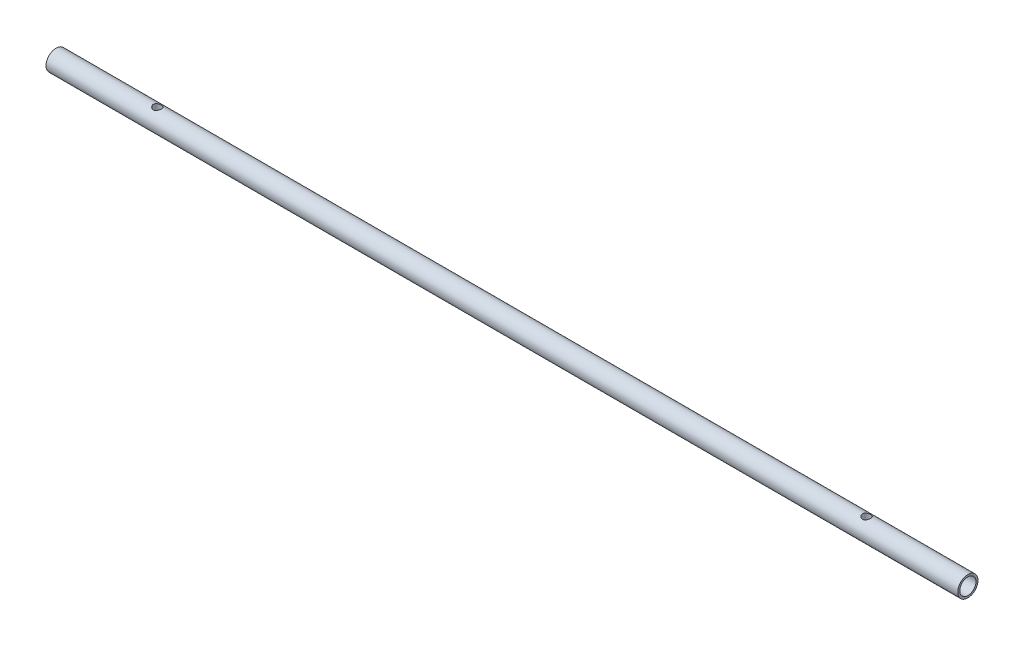
ISO-10303-21;
HEADER;
FILE_DESCRIPTION(('STEP AP214'),'2;1');
FILE_NAME('part.step','',(''),(''),'','','');
FILE_SCHEMA(('AUTOMOTIVE_DESIGN { 1 0 10303 214 1 1 1 1 }'));
ENDSEC;
DATA;
#1=APPLICATION_CONTEXT('core data for automotive mechanical design processes');
#2=APPLICATION_PROTOCOL_DEFINITION('international standard','automotive_design',2000,#1);
#3=PRODUCT_CONTEXT('',#1,'mechanical');
#4=PRODUCT('Part','Part','',(#3));
#5=PRODUCT_RELATED_PRODUCT_CATEGORY('part','',(#4));
#6=PRODUCT_DEFINITION_FORMATION('','',#4);
#7=PRODUCT_DEFINITION_CONTEXT('part definition',#1,'design');
#8=PRODUCT_DEFINITION('design','',#6,#7);
#9=PRODUCT_DEFINITION_SHAPE('','',#8);
#10=(LENGTH_UNIT() NAMED_UNIT(*) SI_UNIT(.MILLI.,.METRE.));
#11=(NAMED_UNIT(*) PLANE_ANGLE_UNIT() SI_UNIT($,.RADIAN.));
#12=(NAMED_UNIT(*) SI_UNIT($,.STERADIAN.) SOLID_ANGLE_UNIT());
#13=UNCERTAINTY_MEASURE_WITH_UNIT(LENGTH_MEASURE(1.E-05),#10,'distance_accuracy_value','');
#14=(GEOMETRIC_REPRESENTATION_CONTEXT(3) GLOBAL_UNCERTAINTY_ASSIGNED_CONTEXT((#13)) GLOBAL_UNIT_ASSIGNED_CONTEXT((#10,
#11,#12)) REPRESENTATION_CONTEXT('',''));
#15=CARTESIAN_POINT('',(0.,0.,0.));
#16=DIRECTION('',(0.,0.,1.));
#17=DIRECTION('',(1.,0.,0.));
#18=AXIS2_PLACEMENT_3D('',#15,#16,#17);
#19=CARTESIAN_POINT('',(900.,0.,0.));
#20=DIRECTION('',(-1.,0.,0.));
#21=DIRECTION('',(0.,0.,1.));
#22=AXIS2_PLACEMENT_3D('',#19,#20,#21);
#23=CYLINDRICAL_SURFACE('',#22,10.);
#24=CARTESIAN_POINT('',(900.,0.,0.));
#25=DIRECTION('',(1.,0.,0.));
#26=DIRECTION('',(0.,0.,-1.));
#27=AXIS2_PLACEMENT_3D('',#24,#25,#26);
#28=CIRCLE('',#27,10.);
#29=CARTESIAN_POINT('',(900.,0.,-10.));
#30=VERTEX_POINT('',#29);
#31=EDGE_CURVE('E10',#30,#30,#28,.T.);
#32=ORIENTED_EDGE('',*,*,#31,.F.);
#33=EDGE_LOOP('',(#32));
#34=FACE_BOUND('',#33,.T.);
#35=CARTESIAN_POINT('',(0.,0.,0.));
#36=DIRECTION('',(1.,0.,0.));
#37=DIRECTION('',(0.,0.,-1.));
#38=AXIS2_PLACEMENT_3D('',#35,#36,#37);
#39=CIRCLE('',#38,10.);
#40=CARTESIAN_POINT('',(0.,0.,-10.));
#41=VERTEX_POINT('',#40);
#42=EDGE_CURVE('E47',#41,#41,#39,.T.);
#43=ORIENTED_EDGE('',*,*,#42,.T.);
#44=EDGE_LOOP('',(#43));
#45=FACE_BOUND('',#44,.T.);
#46=CARTESIAN_POINT('',(800.,-9.16515138991173,-3.99999999999989));
#47=CARTESIAN_POINT('',(800.107177496784,-9.16515220722511,-3.99999917996674));
#48=CARTESIAN_POINT('',(800.214387859795,-9.16703782704593,-3.99568627578821));
#49=CARTESIAN_POINT('',(800.428032094171,-9.17451890581273,-3.97847804504304));
#50=CARTESIAN_POINT('',(800.534465449945,-9.18011663538451,-3.96557746554288));
#51=CARTESIAN_POINT('',(800.745935953356,-9.19485078616079,-3.93129357708767));
#52=CARTESIAN_POINT('',(800.850969884849,-9.20399425848331,-3.90989336356559));
#53=CARTESIAN_POINT('',(801.05868759719,-9.22551446198265,-3.85883937208567));
#54=CARTESIAN_POINT('',(801.161370383102,-9.23789253541718,-3.82918216740115));
#55=CARTESIAN_POINT('',(801.463989726629,-9.27920231487641,-3.72849978450431));
#56=CARTESIAN_POINT('',(801.659537920964,-9.3123881019353,-3.6455922809955));
#57=CARTESIAN_POINT('',(802.033801268673,-9.38629512671442,-3.45083256453876));
#58=CARTESIAN_POINT('',(802.212520085891,-9.42701471853539,-3.3389866715959));
#59=CARTESIAN_POINT('',(802.558511813602,-9.51401677460932,-3.08264624953188));
#60=CARTESIAN_POINT('',(802.724710433289,-9.56047821792027,-2.9367593327213));
#61=CARTESIAN_POINT('',(803.031060408042,-9.65224928088022,-2.61941759406587));
#62=CARTESIAN_POINT('',(803.171202660755,-9.69755849326331,-2.44795387495408));
#63=CARTESIAN_POINT('',(803.426812109837,-9.78406811808178,-2.07601279574984));
#64=CARTESIAN_POINT('',(803.541088419969,-9.82503606295849,-1.87465797803856));
#65=CARTESIAN_POINT('',(803.733687319677,-9.8960785633395,-1.45365059895498));
#66=CARTESIAN_POINT('',(803.812024539433,-9.92615755049624,-1.23400552632818));
#67=CARTESIAN_POINT('',(803.926682927323,-9.97076649749865,-0.793932865332274));
#68=CARTESIAN_POINT('',(803.964854615998,-9.98597873479395,-0.574057972725381));
#69=CARTESIAN_POINT('',(804.004056983501,-10.001606214367,-0.130532654160029));
#70=CARTESIAN_POINT('',(804.005101515044,-10.0020269755724,0.0931163324632467));
#71=CARTESIAN_POINT('',(803.971034457453,-9.98843925626005,0.524464988664043));
#72=CARTESIAN_POINT('',(803.937950453703,-9.9752399353889,0.732354905542557));
#73=CARTESIAN_POINT('',(803.840014248182,-9.93698582942362,1.13934621864239));
#74=CARTESIAN_POINT('',(803.775159715416,-9.91193017443783,1.33844696883612));
#75=CARTESIAN_POINT('',(803.614727034028,-9.85193648913815,1.72579587696684));
#76=CARTESIAN_POINT('',(803.518700570311,-9.81685520932145,1.91383524674328));
#77=CARTESIAN_POINT('',(803.299069986219,-9.74029170360848,2.2716163014973));
#78=CARTESIAN_POINT('',(803.175456413815,-9.6988072853438,2.44135168544));
#79=CARTESIAN_POINT('',(802.894701728095,-9.61043274352157,2.76953765597605));
#80=CARTESIAN_POINT('',(802.73589221485,-9.56336653023495,2.92651569053145));
#81=CARTESIAN_POINT('',(802.39401885634,-9.47123321946551,3.2122148307864));
#82=CARTESIAN_POINT('',(802.21094710361,-9.4261667801616,3.34092668757424));
#83=CARTESIAN_POINT('',(801.819161955251,-9.3419379481804,3.5698083774382));
#84=CARTESIAN_POINT('',(801.609870339322,-9.30297828115415,3.66906930327241));
#85=CARTESIAN_POINT('',(801.175569019376,-9.23775180688173,3.83035251973295));
#86=CARTESIAN_POINT('',(800.950569630547,-9.21147675782625,3.89239899675592));
#87=CARTESIAN_POINT('',(800.505928445065,-9.17659519405436,3.97390989770969));
#88=CARTESIAN_POINT('',(800.286799105743,-9.16700732912279,3.99574419362899));
#89=CARTESIAN_POINT('',(799.847845584481,-9.16378995738082,4.00312265288566));
#90=CARTESIAN_POINT('',(799.628021633448,-9.1701556112073,3.98867782118244));
#91=CARTESIAN_POINT('',(799.207082130086,-9.19712088718234,3.9260657895799));
#92=CARTESIAN_POINT('',(799.0056141252,-9.21688915596611,3.87986612404753));
#93=CARTESIAN_POINT('',(798.613423190429,-9.26740102054687,3.75760837382155));
#94=CARTESIAN_POINT('',(798.422702653785,-9.29814704977203,3.68154366860441));
#95=CARTESIAN_POINT('',(798.048795284409,-9.3686756372021,3.49827127896293));
#96=CARTESIAN_POINT('',(797.866227622613,-9.40877409278364,3.38992573652896));
#97=CARTESIAN_POINT('',(797.521034025115,-9.49300770315594,3.14633044888361));
#98=CARTESIAN_POINT('',(797.358416254402,-9.53714449792086,3.01106974696417));
#99=CARTESIAN_POINT('',(797.045253182809,-9.62841831942848,2.70568842336037));
#100=CARTESIAN_POINT('',(796.896486869445,-9.67553614570512,2.53373085888835));
#101=CARTESIAN_POINT('',(796.629645846752,-9.76439589135029,2.16616726673912));
#102=CARTESIAN_POINT('',(796.511572386703,-9.80613759186126,1.97056027694169));
#103=CARTESIAN_POINT('',(796.309904747181,-9.87967431800933,1.56055986799709));
#104=CARTESIAN_POINT('',(796.226302312053,-9.91147172481883,1.34617096196478));
#105=CARTESIAN_POINT('',(796.096902294801,-9.9614542693725,0.904787181861386));
#106=CARTESIAN_POINT('',(796.051084195687,-9.9796467941012,0.677799220674636));
#107=CARTESIAN_POINT('',(796.000990598089,-9.99958016425669,0.233633020611832));
#108=CARTESIAN_POINT('',(795.994199747923,-10.0023169350655,0.0167809848941637));
#109=CARTESIAN_POINT('',(796.015710953721,-9.9937208474038,-0.414867671174858));
#110=CARTESIAN_POINT('',(796.044007697521,-9.98239011871254,-0.629664597703018));
#111=CARTESIAN_POINT('',(796.133093594213,-9.94743026789156,-1.04434180494591));
#112=CARTESIAN_POINT('',(796.192857956505,-9.92418961491738,-1.24447761316999));
#113=CARTESIAN_POINT('',(796.342105544758,-9.86789895440955,-1.63184470564411));
#114=CARTESIAN_POINT('',(796.431594252056,-9.83484713776135,-1.81907360209118));
#115=CARTESIAN_POINT('',(796.642206647569,-9.76036189588763,-2.18440609879397));
#116=CARTESIAN_POINT('',(796.764553544096,-9.71862262764551,-2.36174083104882));
#117=CARTESIAN_POINT('',(797.035576083636,-9.63178803063431,-2.69410799958839));
#118=CARTESIAN_POINT('',(797.184262624039,-9.58669131729772,-2.84913115669903));
#119=CARTESIAN_POINT('',(797.514634238866,-9.49475540255922,-3.14240275826144));
#120=CARTESIAN_POINT('',(797.697792298702,-9.44798115653709,-3.27901865020174));
#121=CARTESIAN_POINT('',(798.085869721248,-9.36099292501489,-3.51969402497221));
#122=CARTESIAN_POINT('',(798.290791638666,-9.32077971107738,-3.62374968011081));
#123=CARTESIAN_POINT('',(798.69812394378,-9.2551790064237,-3.78798515690825));
#124=CARTESIAN_POINT('',(798.899107675946,-9.22878451494605,-3.85126569346861));
#125=CARTESIAN_POINT('',(799.206638959791,-9.19885565843393,-3.92194632104978));
#126=CARTESIAN_POINT('',(799.310073035895,-9.1904927063377,-3.94146052144912));
#127=CARTESIAN_POINT('',(799.518356929611,-9.17721200341615,-3.97228850679676));
#128=CARTESIAN_POINT('',(799.623205889396,-9.17229225293175,-3.98360705155146));
#129=CARTESIAN_POINT('',(799.773550591353,-9.16783675423421,-3.99384232103274));
#130=CARTESIAN_POINT('',(799.818799830322,-9.16683059815418,-3.99615058414983));
#131=CARTESIAN_POINT('',(799.909364084215,-9.16548771864782,-3.99922965337513));
#132=CARTESIAN_POINT('',(799.954679103716,-9.16515104430397,-4.00000034675773));
#133=CARTESIAN_POINT('',(800.,-9.16515138991173,-3.99999999999989));
#134=B_SPLINE_CURVE_WITH_KNOTS('',3,(#46,#47,#48,#49,#50,#51,#52,#53,#54,#55,#56,#57,#58,#59,
#60,#61,#62,#63,#64,#65,#66,#67,#68,#69,#70,#71,#72,#73,#74,#75,#76,#77,#78,#79,#80,#81,#82,#83,
#84,#85,#86,#87,#88,#89,#90,#91,#92,#93,#94,#95,#96,#97,#98,#99,#100,#101,#102,#103,#104,#105,
#106,#107,#108,#109,#110,#111,#112,#113,#114,#115,#116,#117,#118,#119,#120,#121,#122,#123,#124,
#125,#126,#127,#128,#129,#130,#131,#132,#133),.UNSPECIFIED.,.T.,.F.,(4,2,2,2,2,2,2,2,2,2,2,2,2,
2,2,2,2,2,2,2,2,2,2,2,2,2,2,2,2,2,2,2,2,2,2,2,2,2,2,2,2,2,2,4),(0.,0.321486083338427,
0.643168995111234,0.965494918272717,1.28795480954369,1.92974178448592,2.57138871437642,
3.24631250358765,3.92147162486602,4.62325351972772,5.32474947728874,5.99228379564277,
6.65956904401253,7.28937303450512,7.91922324048022,8.55856614259706,9.19812843669964,
9.87968101952601,10.5614562804415,11.2624893122442,11.963066233901,12.6208430883875,
13.2784204360578,13.8985450996019,14.5188073109317,15.1642232309528,15.8099024284158,
16.5032748228384,17.1966754349538,17.889909884155,18.5827676569814,19.2304209330178,
19.8779761681507,20.5056400267657,21.1334196944703,21.7889411606971,22.4447344691827,
23.1411252036109,23.8375977730824,24.4715333542802,24.7879924179092,25.1042675432744,
25.2402006430815,25.3761437083404),.UNSPECIFIED.);
#135=CARTESIAN_POINT('',(800.,-9.16515138991173,-3.99999999999989));
#136=VERTEX_POINT('',#135);
#137=EDGE_CURVE('E58',#136,#136,#134,.T.);
#138=ORIENTED_EDGE('',*,*,#137,.F.);
#139=EDGE_LOOP('',(#138));
#140=FACE_BOUND('',#139,.T.);
#141=CARTESIAN_POINT('',(800.,9.16515138991173,-3.99999999999989));
#142=CARTESIAN_POINT('',(799.892822503216,9.16515220722511,-3.99999917996674));
#143=CARTESIAN_POINT('',(799.785612140205,9.16703782704593,-3.99568627578821));
#144=CARTESIAN_POINT('',(799.571967905829,9.17451890581273,-3.97847804504304));
#145=CARTESIAN_POINT('',(799.465534550055,9.18011663538451,-3.96557746554288));
#146=CARTESIAN_POINT('',(799.254064046644,9.19485078616079,-3.93129357708767));
#147=CARTESIAN_POINT('',(799.149030115151,9.20399425848331,-3.90989336356559));
#148=CARTESIAN_POINT('',(798.94131240281,9.22551446198265,-3.85883937208567));
#149=CARTESIAN_POINT('',(798.838629616898,9.23789253541718,-3.82918216740115));
#150=CARTESIAN_POINT('',(798.536010273371,9.27920231487641,-3.72849978450431));
#151=CARTESIAN_POINT('',(798.340462079036,9.3123881019353,-3.6455922809955));
#152=CARTESIAN_POINT('',(797.966198731327,9.38629512671442,-3.45083256453876));
#153=CARTESIAN_POINT('',(797.787479914109,9.42701471853539,-3.3389866715959));
#154=CARTESIAN_POINT('',(797.441488186399,9.51401677460932,-3.08264624953188));
#155=CARTESIAN_POINT('',(797.275289566711,9.56047821792027,-2.9367593327213));
#156=CARTESIAN_POINT('',(796.968939591958,9.65224928088022,-2.61941759406587));
#157=CARTESIAN_POINT('',(796.828797339245,9.69755849326331,-2.44795387495408));
#158=CARTESIAN_POINT('',(796.573187890163,9.78406811808178,-2.07601279574984));
#159=CARTESIAN_POINT('',(796.458911580031,9.82503606295849,-1.87465797803856));
#160=CARTESIAN_POINT('',(796.266312680323,9.8960785633395,-1.45365059895498));
#161=CARTESIAN_POINT('',(796.187975460567,9.92615755049624,-1.23400552632818));
#162=CARTESIAN_POINT('',(796.073317072677,9.97076649749865,-0.793932865332274));
#163=CARTESIAN_POINT('',(796.035145384002,9.98597873479395,-0.574057972725381));
#164=CARTESIAN_POINT('',(795.995943016499,10.001606214367,-0.130532654160029));
#165=CARTESIAN_POINT('',(795.994898484956,10.0020269755724,0.0931163324632467));
#166=CARTESIAN_POINT('',(796.028965542547,9.98843925626005,0.524464988664043));
#167=CARTESIAN_POINT('',(796.062049546297,9.9752399353889,0.732354905542557));
#168=CARTESIAN_POINT('',(796.159985751818,9.93698582942362,1.13934621864239));
#169=CARTESIAN_POINT('',(796.224840284585,9.91193017443783,1.33844696883612));
#170=CARTESIAN_POINT('',(796.385272965972,9.85193648913815,1.72579587696684));
#171=CARTESIAN_POINT('',(796.481299429689,9.81685520932145,1.91383524674328));
#172=CARTESIAN_POINT('',(796.700930013781,9.74029170360848,2.2716163014973));
#173=CARTESIAN_POINT('',(796.824543586185,9.6988072853438,2.44135168544));
#174=CARTESIAN_POINT('',(797.105298271905,9.61043274352157,2.76953765597605));
#175=CARTESIAN_POINT('',(797.26410778515,9.56336653023495,2.92651569053145));
#176=CARTESIAN_POINT('',(797.60598114366,9.47123321946551,3.2122148307864));
#177=CARTESIAN_POINT('',(797.78905289639,9.4261667801616,3.34092668757424));
#178=CARTESIAN_POINT('',(798.180838044749,9.3419379481804,3.5698083774382));
#179=CARTESIAN_POINT('',(798.390129660678,9.30297828115415,3.66906930327241));
#180=CARTESIAN_POINT('',(798.824430980624,9.23775180688173,3.83035251973295));
#181=CARTESIAN_POINT('',(799.049430369453,9.21147675782625,3.89239899675592));
#182=CARTESIAN_POINT('',(799.494071554935,9.17659519405436,3.97390989770969));
#183=CARTESIAN_POINT('',(799.713200894258,9.1670073291228,3.99574419362899));
#184=CARTESIAN_POINT('',(800.152154415519,9.16378995738082,4.00312265288566));
#185=CARTESIAN_POINT('',(800.371978366552,9.1701556112073,3.98867782118244));
#186=CARTESIAN_POINT('',(800.792917869914,9.19712088718233,3.92606578957991));
#187=CARTESIAN_POINT('',(800.9943858748,9.2168891559661,3.87986612404755));
#188=CARTESIAN_POINT('',(801.386576809571,9.26740102054687,3.75760837382158));
#189=CARTESIAN_POINT('',(801.577297346215,9.29814704977202,3.68154366860441));
#190=CARTESIAN_POINT('',(801.951204715591,9.36867563720211,3.49827127896291));
#191=CARTESIAN_POINT('',(802.133772377387,9.40877409278366,3.38992573652891));
#192=CARTESIAN_POINT('',(802.478965974885,9.49300770315596,3.14633044888354));
#193=CARTESIAN_POINT('',(802.641583745598,9.53714449792087,3.01106974696412));
#194=CARTESIAN_POINT('',(802.954746817191,9.6284183194285,2.70568842336033));
#195=CARTESIAN_POINT('',(803.103513130555,9.67553614570513,2.53373085888829));
#196=CARTESIAN_POINT('',(803.370354153248,9.7643958913503,2.16616726673905));
#197=CARTESIAN_POINT('',(803.488427613298,9.80613759186126,1.97056027694164));
#198=CARTESIAN_POINT('',(803.69009525282,9.87967431800934,1.56055986799706));
#199=CARTESIAN_POINT('',(803.773697687947,9.91147172481884,1.34617096196475));
#200=CARTESIAN_POINT('',(803.903097705199,9.9614542693725,0.904787181861355));
#201=CARTESIAN_POINT('',(803.948915804313,9.9796467941012,0.677799220674615));
#202=CARTESIAN_POINT('',(803.999009401911,9.99958016425669,0.233633020611829));
#203=CARTESIAN_POINT('',(804.005800252077,10.0023169350655,0.0167809848941661));
#204=CARTESIAN_POINT('',(803.98428904628,9.9937208474038,-0.414867671174853));
#205=CARTESIAN_POINT('',(803.955992302479,9.98239011871254,-0.629664597703016));
#206=CARTESIAN_POINT('',(803.866906405787,9.94743026789156,-1.04434180494591));
#207=CARTESIAN_POINT('',(803.807142043495,9.92418961491738,-1.24447761316999));
#208=CARTESIAN_POINT('',(803.657894455242,9.86789895440955,-1.63184470564411));
#209=CARTESIAN_POINT('',(803.568405747944,9.83484713776135,-1.81907360209118));
#210=CARTESIAN_POINT('',(803.357793352431,9.76036189588763,-2.18440609879397));
#211=CARTESIAN_POINT('',(803.235446455904,9.71862262764551,-2.36174083104882));
#212=CARTESIAN_POINT('',(802.964423916364,9.63178803063431,-2.69410799958839));
#213=CARTESIAN_POINT('',(802.815737375961,9.58669131729772,-2.84913115669903));
#214=CARTESIAN_POINT('',(802.485365761134,9.49475540255922,-3.14240275826144));
#215=CARTESIAN_POINT('',(802.302207701298,9.44798115653709,-3.27901865020174));
#216=CARTESIAN_POINT('',(801.914130278752,9.36099292501489,-3.51969402497221));
#217=CARTESIAN_POINT('',(801.709208361334,9.32077971107739,-3.62374968011081));
#218=CARTESIAN_POINT('',(801.30187605622,9.25517900642371,-3.78798515690823));
#219=CARTESIAN_POINT('',(801.100892324054,9.22878451494606,-3.85126569346859));
#220=CARTESIAN_POINT('',(800.793361040209,9.19885565843394,-3.92194632104976));
#221=CARTESIAN_POINT('',(800.689926964105,9.19049270633771,-3.9414605214491));
#222=CARTESIAN_POINT('',(800.481643070389,9.17721200341616,-3.97228850679675));
#223=CARTESIAN_POINT('',(800.376794110604,9.17229225293175,-3.98360705155146));
#224=CARTESIAN_POINT('',(800.226449408648,9.16783675423422,-3.99384232103273));
#225=CARTESIAN_POINT('',(800.181200169678,9.16683059815419,-3.99615058414982));
#226=CARTESIAN_POINT('',(800.090635915785,9.16548771864782,-3.99922965337512));
#227=CARTESIAN_POINT('',(800.045320896284,9.16515104430397,-4.00000034675773));
#228=CARTESIAN_POINT('',(800.,9.16515138991173,-3.99999999999989));
#229=B_SPLINE_CURVE_WITH_KNOTS('',3,(#141,#142,#143,#144,#145,#146,#147,#148,#149,#150,#151,
#152,#153,#154,#155,#156,#157,#158,#159,#160,#161,#162,#163,#164,#165,#166,#167,#168,#169,#170,
#171,#172,#173,#174,#175,#176,#177,#178,#179,#180,#181,#182,#183,#184,#185,#186,#187,#188,#189,
#190,#191,#192,#193,#194,#195,#196,#197,#198,#199,#200,#201,#202,#203,#204,#205,#206,#207,#208,
#209,#210,#211,#212,#213,#214,#215,#216,#217,#218,#219,#220,#221,#222,#223,#224,#225,#226,#227,
#228),.UNSPECIFIED.,.T.,.F.,(4,2,2,2,2,2,2,2,2,2,2,2,2,2,2,2,2,2,2,2,2,2,2,2,2,2,2,2,2,2,2,2,2,
2,2,2,2,2,2,2,2,2,2,4),(0.,0.321486083338427,0.643168995111234,0.965494918272717,
1.28795480954369,1.92974178448592,2.57138871437642,3.24631250358765,3.92147162486602,
4.62325351972772,5.32474947728874,5.99228379564277,6.65956904401253,7.28937303450512,
7.91922324048022,8.55856614259706,9.19812843669964,9.87968101952601,10.5614562804415,
11.2624893122442,11.963066233901,12.6208430883875,13.2784204360578,13.8985450996018,
14.5188073109317,15.164223230953,15.8099024284159,16.5032748228386,17.1966754349538,
17.8899098841551,18.5827676569815,19.2304209330178,19.8779761681508,20.5056400267657,
21.1334196944704,21.7889411606971,22.4447344691828,23.141125203611,23.8375977730824,
24.4715333542801,24.7879924179091,25.1042675432744,25.2402006430813,25.3761437083404),.UNSPECIFIED.);
#230=CARTESIAN_POINT('',(800.,9.16515138991173,-3.99999999999989));
#231=VERTEX_POINT('',#230);
#232=EDGE_CURVE('E70',#231,#231,#229,.T.);
#233=ORIENTED_EDGE('',*,*,#232,.F.);
#234=EDGE_LOOP('',(#233));
#235=FACE_BOUND('',#234,.T.);
#236=CARTESIAN_POINT('',(100.,-9.16515138991168,-4.00000000000001));
#237=CARTESIAN_POINT('',(100.107177496784,-9.16515220722506,-3.99999917996686));
#238=CARTESIAN_POINT('',(100.214387859795,-9.16703782704588,-3.99568627578832));
#239=CARTESIAN_POINT('',(100.428032094171,-9.17451890581268,-3.97847804504316));
#240=CARTESIAN_POINT('',(100.534465449945,-9.18011663538446,-3.965577465543));
#241=CARTESIAN_POINT('',(100.745935953356,-9.19485078616074,-3.9312935770878));
#242=CARTESIAN_POINT('',(100.850969884849,-9.20399425848326,-3.90989336356572));
#243=CARTESIAN_POINT('',(101.05868759719,-9.22551446198259,-3.8588393720858));
#244=CARTESIAN_POINT('',(101.161370383102,-9.23789253541712,-3.82918216740129));
#245=CARTESIAN_POINT('',(101.463989726629,-9.27920231487636,-3.72849978450445));
#246=CARTESIAN_POINT('',(101.659537920964,-9.31238810193525,-3.64559228099563));
#247=CARTESIAN_POINT('',(102.033801268673,-9.38629512671437,-3.45083256453888));
#248=CARTESIAN_POINT('',(102.212520085891,-9.42701471853534,-3.33898667159604));
#249=CARTESIAN_POINT('',(102.558511813601,-9.51401677460926,-3.08264624953204));
#250=CARTESIAN_POINT('',(102.724710433289,-9.56047821792022,-2.93675933272146));
#251=CARTESIAN_POINT('',(103.031060408042,-9.65224928088017,-2.61941759406606));
#252=CARTESIAN_POINT('',(103.171202660755,-9.69755849326326,-2.44795387495429));
#253=CARTESIAN_POINT('',(103.426812109837,-9.78406811808174,-2.07601279575005));
#254=CARTESIAN_POINT('',(103.541088419969,-9.82503606295845,-1.87465797803874));
#255=CARTESIAN_POINT('',(103.733687319677,-9.89607856333948,-1.45365059895514));
#256=CARTESIAN_POINT('',(103.812024539433,-9.92615755049622,-1.23400552632834));
#257=CARTESIAN_POINT('',(103.926682927323,-9.97076649749865,-0.793932865332421));
#258=CARTESIAN_POINT('',(103.964854615998,-9.98597873479395,-0.574057972725516));
#259=CARTESIAN_POINT('',(104.004056983501,-10.001606214367,-0.13053265416015));
#260=CARTESIAN_POINT('',(104.005101515045,-10.0020269755724,0.0931163324631291));
#261=CARTESIAN_POINT('',(103.971034457454,-9.98843925626005,0.52446498866394));
#262=CARTESIAN_POINT('',(103.937950453703,-9.9752399353889,0.732354905542466));
#263=CARTESIAN_POINT('',(103.840014248182,-9.93698582942363,1.13934621864231));
#264=CARTESIAN_POINT('',(103.775159715416,-9.91193017443784,1.33844696883604));
#265=CARTESIAN_POINT('',(103.614727034028,-9.85193648913816,1.72579587696676));
#266=CARTESIAN_POINT('',(103.518700570311,-9.81685520932146,1.9138352467432));
#267=CARTESIAN_POINT('',(103.29906998622,-9.7402917036085,2.27161630149724));
#268=CARTESIAN_POINT('',(103.175456413816,-9.69880728534381,2.44135168543996));
#269=CARTESIAN_POINT('',(102.894701728095,-9.61043274352157,2.76953765597607));
#270=CARTESIAN_POINT('',(102.73589221485,-9.56336653023493,2.92651569053149));
#271=CARTESIAN_POINT('',(102.394018856341,-9.47123321946549,3.21221483078646));
#272=CARTESIAN_POINT('',(102.21094710361,-9.42616678016159,3.34092668757429));
#273=CARTESIAN_POINT('',(101.819161955251,-9.34193794818039,3.56980837743823));
#274=CARTESIAN_POINT('',(101.609870339322,-9.30297828115413,3.66906930327245));
#275=CARTESIAN_POINT('',(101.175569019376,-9.2377518068817,3.83035251973301));
#276=CARTESIAN_POINT('',(100.950569630547,-9.21147675782622,3.89239899675599));
#277=CARTESIAN_POINT('',(100.505928445065,-9.17659519405431,3.97390989770978));
#278=CARTESIAN_POINT('',(100.286799105743,-9.16700732912275,3.99574419362909));
#279=CARTESIAN_POINT('',(99.8478455844809,-9.16378995738077,4.00312265288578));
#280=CARTESIAN_POINT('',(99.6280216334487,-9.17015561120724,3.98867782118258));
#281=CARTESIAN_POINT('',(99.2070821300862,-9.19712088718227,3.92606578958006));
#282=CARTESIAN_POINT('',(99.0056141252,-9.21688915596603,3.87986612404772));
#283=CARTESIAN_POINT('',(98.613423190429,-9.26740102054679,3.75760837382175));
#284=CARTESIAN_POINT('',(98.4227026537853,-9.29814704977195,3.6815436686046));
#285=CARTESIAN_POINT('',(98.0487952844092,-9.36867563720203,3.49827127896312));
#286=CARTESIAN_POINT('',(97.8662276226128,-9.40877409278357,3.38992573652915));
#287=CARTESIAN_POINT('',(97.521034025115,-9.49300770315587,3.1463304488838));
#288=CARTESIAN_POINT('',(97.3584162544022,-9.5371444979208,3.01106974696436));
#289=CARTESIAN_POINT('',(97.0452531828087,-9.62841831942843,2.70568842336056));
#290=CARTESIAN_POINT('',(96.8964868694455,-9.67553614570506,2.53373085888855));
#291=CARTESIAN_POINT('',(96.6296458467518,-9.76439589135024,2.16616726673934));
#292=CARTESIAN_POINT('',(96.5115723867026,-9.80613759186121,1.97056027694193));
#293=CARTESIAN_POINT('',(96.3099047471805,-9.87967431800929,1.56055986799732));
#294=CARTESIAN_POINT('',(96.2263023120528,-9.9114717248188,1.34617096196499));
#295=CARTESIAN_POINT('',(96.0969022948006,-9.96145426937248,0.904787181861562));
#296=CARTESIAN_POINT('',(96.0510841956866,-9.97964679410119,0.677799220674794));
#297=CARTESIAN_POINT('',(96.000990598089,-9.99958016425668,0.233633020611971));
#298=CARTESIAN_POINT('',(95.9941997479232,-10.0023169350655,0.0167809848943008));
#299=CARTESIAN_POINT('',(96.0157109537205,-9.99372084740381,-0.414867671174728));
#300=CARTESIAN_POINT('',(96.044007697521,-9.98239011871255,-0.629664597702893));
#301=CARTESIAN_POINT('',(96.1330935942128,-9.94743026789157,-1.04434180494581));
#302=CARTESIAN_POINT('',(96.1928579565051,-9.92418961491739,-1.24447761316991));
#303=CARTESIAN_POINT('',(96.3421055447579,-9.86789895440956,-1.63184470564404));
#304=CARTESIAN_POINT('',(96.431594252056,-9.83484713776136,-1.81907360209112));
#305=CARTESIAN_POINT('',(96.6422066475684,-9.76036189588764,-2.18440609879393));
#306=CARTESIAN_POINT('',(96.7645535440962,-9.71862262764552,-2.3617408310488));
#307=CARTESIAN_POINT('',(97.0355760836362,-9.63178803063432,-2.69410799958838));
#308=CARTESIAN_POINT('',(97.1842626240391,-9.58669131729773,-2.849131156699));
#309=CARTESIAN_POINT('',(97.5146342388658,-9.49475540255923,-3.14240275826142));
#310=CARTESIAN_POINT('',(97.6977922987021,-9.4479811565371,-3.27901865020173));
#311=CARTESIAN_POINT('',(98.0858697212477,-9.36099292501489,-3.51969402497222));
#312=CARTESIAN_POINT('',(98.2907916386662,-9.32077971107738,-3.62374968011083));
#313=CARTESIAN_POINT('',(98.6981239437796,-9.25517900642368,-3.78798515690828));
#314=CARTESIAN_POINT('',(98.8991076759459,-9.22878451494603,-3.85126569346866));
#315=CARTESIAN_POINT('',(99.2066389597908,-9.1988556584339,-3.92194632104985));
#316=CARTESIAN_POINT('',(99.3100730358944,-9.19049270633767,-3.94146052144919));
#317=CARTESIAN_POINT('',(99.5183569296109,-9.17721200341611,-3.97228850679684));
#318=CARTESIAN_POINT('',(99.623205889396,-9.17229225293171,-3.98360705155155));
#319=CARTESIAN_POINT('',(99.7735505913525,-9.16783675423417,-3.99384232103284));
#320=CARTESIAN_POINT('',(99.8187998303222,-9.16683059815414,-3.99615058414994));
#321=CARTESIAN_POINT('',(99.9093640842146,-9.16548771864777,-3.99922965337524));
#322=CARTESIAN_POINT('',(99.9546791037162,-9.16515104430391,-4.00000034675785));
#323=CARTESIAN_POINT('',(100.,-9.16515138991168,-4.00000000000001));
#324=B_SPLINE_CURVE_WITH_KNOTS('',3,(#236,#237,#238,#239,#240,#241,#242,#243,#244,#245,#246,
#247,#248,#249,#250,#251,#252,#253,#254,#255,#256,#257,#258,#259,#260,#261,#262,#263,#264,#265,
#266,#267,#268,#269,#270,#271,#272,#273,#274,#275,#276,#277,#278,#279,#280,#281,#282,#283,#284,
#285,#286,#287,#288,#289,#290,#291,#292,#293,#294,#295,#296,#297,#298,#299,#300,#301,#302,#303,
#304,#305,#306,#307,#308,#309,#310,#311,#312,#313,#314,#315,#316,#317,#318,#319,#320,#321,#322,
#323),.UNSPECIFIED.,.T.,.F.,(4,2,2,2,2,2,2,2,2,2,2,2,2,2,2,2,2,2,2,2,2,2,2,2,2,2,2,2,2,2,2,2,2,
2,2,2,2,2,2,2,2,2,2,4),(0.,0.3214860833384,0.643168995111178,0.965494918272688,1.28795480954364,
1.92974178448595,2.57138871437638,3.24631250358765,3.92147162486599,4.62325351972772,
5.32474947728876,5.99228379564283,6.6595690440126,7.28937303450521,7.91922324048035,
8.55856614259713,9.19812843669979,9.87968101952627,10.5614562804417,11.2624893122443,
11.9630662339012,12.6208430883876,13.2784204360579,13.8985450996021,14.5188073109319,
15.1642232309532,15.8099024284161,16.5032748228387,17.1966754349541,17.8899098841554,
18.5827676569819,19.2304209330182,19.8779761681512,20.5056400267662,21.1334196944709,
21.7889411606977,22.4447344691833,23.1411252036115,23.837597773083,24.4715333542807,
24.7879924179097,25.104267543275,25.240200643082,25.3761437083412),.UNSPECIFIED.);
#325=CARTESIAN_POINT('',(100.,-9.16515138991168,-4.00000000000001));
#326=VERTEX_POINT('',#325);
#327=EDGE_CURVE('E118',#326,#326,#324,.T.);
#328=ORIENTED_EDGE('',*,*,#327,.F.);
#329=EDGE_LOOP('',(#328));
#330=FACE_BOUND('',#329,.T.);
#331=CARTESIAN_POINT('',(100.,9.16515138991168,-4.00000000000001));
#332=CARTESIAN_POINT('',(99.8928225032157,9.16515220722506,-3.99999917996686));
#333=CARTESIAN_POINT('',(99.7856121402052,9.16703782704588,-3.99568627578832));
#334=CARTESIAN_POINT('',(99.5719679058294,9.17451890581268,-3.97847804504316));
#335=CARTESIAN_POINT('',(99.4655345500547,9.18011663538446,-3.965577465543));
#336=CARTESIAN_POINT('',(99.2540640466445,9.19485078616074,-3.9312935770878));
#337=CARTESIAN_POINT('',(99.1490301151514,9.20399425848326,-3.90989336356572));
#338=CARTESIAN_POINT('',(98.9413124028103,9.22551446198259,-3.8588393720858));
#339=CARTESIAN_POINT('',(98.8386296168983,9.23789253541712,-3.82918216740129));
#340=CARTESIAN_POINT('',(98.5360102733714,9.27920231487636,-3.72849978450445));
#341=CARTESIAN_POINT('',(98.3404620790357,9.31238810193525,-3.64559228099563));
#342=CARTESIAN_POINT('',(97.9661987313271,9.38629512671437,-3.45083256453889));
#343=CARTESIAN_POINT('',(97.7874799141088,9.42701471853533,-3.33898667159604));
#344=CARTESIAN_POINT('',(97.4414881863986,9.51401677460926,-3.08264624953204));
#345=CARTESIAN_POINT('',(97.275289566711,9.56047821792022,-2.93675933272146));
#346=CARTESIAN_POINT('',(96.9689395919581,9.65224928088017,-2.61941759406606));
#347=CARTESIAN_POINT('',(96.8287973392451,9.69755849326326,-2.44795387495429));
#348=CARTESIAN_POINT('',(96.5731878901629,9.78406811808174,-2.07601279575005));
#349=CARTESIAN_POINT('',(96.4589115800306,9.82503606295845,-1.87465797803874));
#350=CARTESIAN_POINT('',(96.2663126803231,9.89607856333948,-1.45365059895514));
#351=CARTESIAN_POINT('',(96.1879754605668,9.92615755049622,-1.23400552632834));
#352=CARTESIAN_POINT('',(96.0733170726771,9.97076649749865,-0.793932865332421));
#353=CARTESIAN_POINT('',(96.035145384002,9.98597873479395,-0.574057972725516));
#354=CARTESIAN_POINT('',(95.9959430164992,10.001606214367,-0.13053265416015));
#355=CARTESIAN_POINT('',(95.9948984849555,10.0020269755724,0.0931163324631291));
#356=CARTESIAN_POINT('',(96.0289655425465,9.98843925626005,0.52446498866394));
#357=CARTESIAN_POINT('',(96.0620495462971,9.9752399353889,0.732354905542466));
#358=CARTESIAN_POINT('',(96.1599857518182,9.93698582942363,1.13934621864231));
#359=CARTESIAN_POINT('',(96.2248402845844,9.91193017443784,1.33844696883604));
#360=CARTESIAN_POINT('',(96.3852729659723,9.85193648913816,1.72579587696676));
#361=CARTESIAN_POINT('',(96.4812994296887,9.81685520932146,1.9138352467432));
#362=CARTESIAN_POINT('',(96.7009300137804,9.7402917036085,2.27161630149724));
#363=CARTESIAN_POINT('',(96.8245435861844,9.69880728534381,2.44135168543996));
#364=CARTESIAN_POINT('',(97.1052982719048,9.61043274352157,2.76953765597607));
#365=CARTESIAN_POINT('',(97.2641077851502,9.56336653023493,2.92651569053149));
#366=CARTESIAN_POINT('',(97.6059811436595,9.47123321946549,3.21221483078646));
#367=CARTESIAN_POINT('',(97.78905289639,9.42616678016159,3.34092668757429));
#368=CARTESIAN_POINT('',(98.1808380447492,9.34193794818039,3.56980837743823));
#369=CARTESIAN_POINT('',(98.3901296606777,9.30297828115413,3.66906930327245));
#370=CARTESIAN_POINT('',(98.8244309806241,9.2377518068817,3.83035251973301));
#371=CARTESIAN_POINT('',(99.0494303694531,9.21147675782622,3.89239899675599));
#372=CARTESIAN_POINT('',(99.494071554935,9.17659519405432,3.97390989770977));
#373=CARTESIAN_POINT('',(99.7132008942572,9.16700732912275,3.99574419362908));
#374=CARTESIAN_POINT('',(100.152154415519,9.16378995738077,4.00312265288578));
#375=CARTESIAN_POINT('',(100.371978366551,9.17015561120724,3.98867782118258));
#376=CARTESIAN_POINT('',(100.792917869914,9.19712088718227,3.92606578958006));
#377=CARTESIAN_POINT('',(100.9943858748,9.21688915596603,3.87986612404772));
#378=CARTESIAN_POINT('',(101.386576809571,9.26740102054679,3.75760837382176));
#379=CARTESIAN_POINT('',(101.577297346215,9.29814704977195,3.6815436686046));
#380=CARTESIAN_POINT('',(101.951204715591,9.36867563720203,3.49827127896312));
#381=CARTESIAN_POINT('',(102.133772377387,9.40877409278357,3.38992573652915));
#382=CARTESIAN_POINT('',(102.478965974885,9.49300770315587,3.1463304488838));
#383=CARTESIAN_POINT('',(102.641583745598,9.5371444979208,3.01106974696436));
#384=CARTESIAN_POINT('',(102.954746817191,9.62841831942843,2.70568842336056));
#385=CARTESIAN_POINT('',(103.103513130555,9.67553614570507,2.53373085888854));
#386=CARTESIAN_POINT('',(103.370354153248,9.76439589135024,2.16616726673933));
#387=CARTESIAN_POINT('',(103.488427613298,9.80613759186121,1.97056027694192));
#388=CARTESIAN_POINT('',(103.69009525282,9.87967431800929,1.56055986799732));
#389=CARTESIAN_POINT('',(103.773697687947,9.9114717248188,1.346170961965));
#390=CARTESIAN_POINT('',(103.903097705199,9.96145426937248,0.904787181861565));
#391=CARTESIAN_POINT('',(103.948915804313,9.97964679410119,0.677799220674796));
#392=CARTESIAN_POINT('',(103.999009401911,9.99958016425668,0.233633020611971));
#393=CARTESIAN_POINT('',(104.005800252077,10.0023169350655,0.0167809848943008));
#394=CARTESIAN_POINT('',(103.98428904628,9.99372084740381,-0.414867671174728));
#395=CARTESIAN_POINT('',(103.955992302479,9.98239011871255,-0.629664597702893));
#396=CARTESIAN_POINT('',(103.866906405787,9.94743026789157,-1.04434180494581));
#397=CARTESIAN_POINT('',(103.807142043495,9.92418961491738,-1.2444776131699));
#398=CARTESIAN_POINT('',(103.657894455242,9.86789895440956,-1.63184470564404));
#399=CARTESIAN_POINT('',(103.568405747944,9.83484713776136,-1.81907360209112));
#400=CARTESIAN_POINT('',(103.357793352432,9.76036189588764,-2.18440609879394));
#401=CARTESIAN_POINT('',(103.235446455904,9.71862262764552,-2.36174083104881));
#402=CARTESIAN_POINT('',(102.964423916364,9.63178803063431,-2.69410799958838));
#403=CARTESIAN_POINT('',(102.815737375961,9.58669131729773,-2.849131156699));
#404=CARTESIAN_POINT('',(102.485365761134,9.49475540255923,-3.14240275826141));
#405=CARTESIAN_POINT('',(102.302207701298,9.4479811565371,-3.27901865020172));
#406=CARTESIAN_POINT('',(101.914130278752,9.36099292501489,-3.51969402497221));
#407=CARTESIAN_POINT('',(101.709208361334,9.32077971107738,-3.62374968011083));
#408=CARTESIAN_POINT('',(101.30187605622,9.25517900642369,-3.78798515690828));
#409=CARTESIAN_POINT('',(101.100892324054,9.22878451494603,-3.85126569346866));
#410=CARTESIAN_POINT('',(100.793361040209,9.1988556584339,-3.92194632104984));
#411=CARTESIAN_POINT('',(100.689926964106,9.19049270633767,-3.94146052144919));
#412=CARTESIAN_POINT('',(100.481643070389,9.17721200341611,-3.97228850679684));
#413=CARTESIAN_POINT('',(100.376794110604,9.17229225293171,-3.98360705155155));
#414=CARTESIAN_POINT('',(100.226449408648,9.16783675423417,-3.99384232103284));
#415=CARTESIAN_POINT('',(100.181200169678,9.16683059815414,-3.99615058414994));
#416=CARTESIAN_POINT('',(100.090635915785,9.16548771864777,-3.99922965337524));
#417=CARTESIAN_POINT('',(100.045320896284,9.16515104430391,-4.00000034675785));
#418=CARTESIAN_POINT('',(100.,9.16515138991168,-4.00000000000001));
#419=B_SPLINE_CURVE_WITH_KNOTS('',3,(#331,#332,#333,#334,#335,#336,#337,#338,#339,#340,#341,
#342,#343,#344,#345,#346,#347,#348,#349,#350,#351,#352,#353,#354,#355,#356,#357,#358,#359,#360,
#361,#362,#363,#364,#365,#366,#367,#368,#369,#370,#371,#372,#373,#374,#375,#376,#377,#378,#379,
#380,#381,#382,#383,#384,#385,#386,#387,#388,#389,#390,#391,#392,#393,#394,#395,#396,#397,#398,
#399,#400,#401,#402,#403,#404,#405,#406,#407,#408,#409,#410,#411,#412,#413,#414,#415,#416,#417,
#418),.UNSPECIFIED.,.T.,.F.,(4,2,2,2,2,2,2,2,2,2,2,2,2,2,2,2,2,2,2,2,2,2,2,2,2,2,2,2,2,2,2,2,2,
2,2,2,2,2,2,2,2,2,2,4),(0.,0.3214860833384,0.643168995111178,0.965494918272687,1.28795480954364,
1.92974178448593,2.57138871437638,3.24631250358765,3.92147162486599,4.62325351972772,
5.32474947728876,5.99228379564283,6.6595690440126,7.28937303450521,7.91922324048035,
8.55856614259713,9.19812843669979,9.87968101952627,10.5614562804417,11.2624893122443,
11.9630662339012,12.6208430883876,13.2784204360579,13.8985450996021,14.5188073109319,
15.1642232309532,15.8099024284161,16.5032748228388,17.1966754349541,17.8899098841554,
18.5827676569819,19.2304209330182,19.8779761681512,20.5056400267662,21.1334196944709,
21.7889411606977,22.4447344691833,23.1411252036114,23.837597773083,24.4715333542807,
24.7879924179097,25.104267543275,25.240200643082,25.3761437083412),.UNSPECIFIED.);
#420=CARTESIAN_POINT('',(100.,9.16515138991168,-4.00000000000001));
#421=VERTEX_POINT('',#420);
#422=EDGE_CURVE('E41',#421,#421,#419,.T.);
#423=ORIENTED_EDGE('',*,*,#422,.F.);
#424=EDGE_LOOP('',(#423));
#425=FACE_BOUND('',#424,.T.);
#426=ADVANCED_FACE('F40',(#34,#45,#140,#235,#330,#425),#23,.T.);
#427=CARTESIAN_POINT('',(900.,0.,0.));
#428=DIRECTION('',(1.,0.,0.));
#429=DIRECTION('',(0.,0.,-1.));
#430=AXIS2_PLACEMENT_3D('',#427,#428,#429);
#431=PLANE('',#430);
#432=CARTESIAN_POINT('',(900.,0.,0.));
#433=DIRECTION('',(1.,0.,0.));
#434=DIRECTION('',(0.,0.,-1.));
#435=AXIS2_PLACEMENT_3D('',#432,#433,#434);
#436=CIRCLE('',#435,8.);
#437=CARTESIAN_POINT('',(900.,0.,-8.));
#438=VERTEX_POINT('',#437);
#439=EDGE_CURVE('E60',#438,#438,#436,.T.);
#440=ORIENTED_EDGE('',*,*,#439,.F.);
#441=EDGE_LOOP('',(#440));
#442=FACE_BOUND('',#441,.T.);
#443=ORIENTED_EDGE('',*,*,#31,.T.);
#444=EDGE_LOOP('',(#443));
#445=FACE_BOUND('',#444,.T.);
#446=ADVANCED_FACE('F96',(#442,#445),#431,.T.);
#447=CARTESIAN_POINT('',(0.,0.,0.));
#448=DIRECTION('',(1.,0.,0.));
#449=DIRECTION('',(0.,0.,-1.));
#450=AXIS2_PLACEMENT_3D('',#447,#448,#449);
#451=PLANE('',#450);
#452=CARTESIAN_POINT('',(0.,0.,0.));
#453=DIRECTION('',(-1.,0.,0.));
#454=DIRECTION('',(0.,0.,1.));
#455=AXIS2_PLACEMENT_3D('',#452,#453,#454);
#456=CIRCLE('',#455,8.);
#457=CARTESIAN_POINT('',(0.,0.,8.));
#458=VERTEX_POINT('',#457);
#459=EDGE_CURVE('E124',#458,#458,#456,.T.);
#460=ORIENTED_EDGE('',*,*,#459,.F.);
#461=EDGE_LOOP('',(#460));
#462=FACE_BOUND('',#461,.T.);
#463=ORIENTED_EDGE('',*,*,#42,.F.);
#464=EDGE_LOOP('',(#463));
#465=FACE_BOUND('',#464,.T.);
#466=ADVANCED_FACE('F94',(#462,#465),#451,.F.);
#467=CARTESIAN_POINT('',(860.,0.,0.));
#468=DIRECTION('',(1.,0.,0.));
#469=DIRECTION('',(0.,0.,-1.));
#470=AXIS2_PLACEMENT_3D('',#467,#468,#469);
#471=CYLINDRICAL_SURFACE('',#470,8.);
#472=CARTESIAN_POINT('',(860.,0.,0.));
#473=DIRECTION('',(1.,0.,0.));
#474=DIRECTION('',(0.,0.,-1.));
#475=AXIS2_PLACEMENT_3D('',#472,#473,#474);
#476=CIRCLE('',#475,8.);
#477=CARTESIAN_POINT('',(860.,0.,-8.));
#478=VERTEX_POINT('',#477);
#479=EDGE_CURVE('E53',#478,#478,#476,.T.);
#480=ORIENTED_EDGE('',*,*,#479,.F.);
#481=EDGE_LOOP('',(#480));
#482=FACE_BOUND('',#481,.T.);
#483=ORIENTED_EDGE('',*,*,#439,.T.);
#484=EDGE_LOOP('',(#483));
#485=FACE_BOUND('',#484,.T.);
#486=ADVANCED_FACE('F89',(#482,#485),#471,.F.);
#487=CARTESIAN_POINT('',(860.,0.,0.));
#488=DIRECTION('',(1.,0.,0.));
#489=DIRECTION('',(0.,0.,-1.));
#490=AXIS2_PLACEMENT_3D('',#487,#488,#489);
#491=PLANE('',#490);
#492=ORIENTED_EDGE('',*,*,#479,.T.);
#493=EDGE_LOOP('',(#492));
#494=FACE_BOUND('',#493,.T.);
#495=ADVANCED_FACE('F88',(#494),#491,.T.);
#496=CARTESIAN_POINT('',(40.,0.,0.));
#497=DIRECTION('',(-1.,0.,0.));
#498=DIRECTION('',(0.,0.,1.));
#499=AXIS2_PLACEMENT_3D('',#496,#497,#498);
#500=CYLINDRICAL_SURFACE('',#499,8.);
#501=CARTESIAN_POINT('',(40.,0.,0.));
#502=DIRECTION('',(-1.,0.,0.));
#503=DIRECTION('',(0.,0.,1.));
#504=AXIS2_PLACEMENT_3D('',#501,#502,#503);
#505=CIRCLE('',#504,8.);
#506=CARTESIAN_POINT('',(40.,0.,8.));
#507=VERTEX_POINT('',#506);
#508=EDGE_CURVE('E127',#507,#507,#505,.T.);
#509=ORIENTED_EDGE('',*,*,#508,.F.);
#510=EDGE_LOOP('',(#509));
#511=FACE_BOUND('',#510,.T.);
#512=ORIENTED_EDGE('',*,*,#459,.T.);
#513=EDGE_LOOP('',(#512));
#514=FACE_BOUND('',#513,.T.);
#515=ADVANCED_FACE('F85',(#511,#514),#500,.F.);
#516=CARTESIAN_POINT('',(40.,0.,0.));
#517=DIRECTION('',(-1.,0.,0.));
#518=DIRECTION('',(0.,0.,1.));
#519=AXIS2_PLACEMENT_3D('',#516,#517,#518);
#520=PLANE('',#519);
#521=ORIENTED_EDGE('',*,*,#508,.T.);
#522=EDGE_LOOP('',(#521));
#523=FACE_BOUND('',#522,.T.);
#524=ADVANCED_FACE('F77',(#523),#520,.T.);
#525=CARTESIAN_POINT('',(800.,40.,0.));
#526=DIRECTION('',(0.,-1.,0.));
#527=DIRECTION('',(0.,0.,-1.));
#528=AXIS2_PLACEMENT_3D('',#525,#526,#527);
#529=CYLINDRICAL_SURFACE('',#528,3.99999999999989);
#530=ORIENTED_EDGE('',*,*,#137,.T.);
#531=EDGE_LOOP('',(#530));
#532=FACE_BOUND('',#531,.T.);
#533=ORIENTED_EDGE('',*,*,#232,.T.);
#534=EDGE_LOOP('',(#533));
#535=FACE_BOUND('',#534,.T.);
#536=ADVANCED_FACE('F72',(#532,#535),#529,.F.);
#537=CARTESIAN_POINT('',(100.,40.,0.));
#538=DIRECTION('',(0.,-1.,0.));
#539=DIRECTION('',(0.,0.,-1.));
#540=AXIS2_PLACEMENT_3D('',#537,#538,#539);
#541=CYLINDRICAL_SURFACE('',#540,4.00000000000001);
#542=ORIENTED_EDGE('',*,*,#327,.T.);
#543=EDGE_LOOP('',(#542));
#544=FACE_BOUND('',#543,.T.);
#545=ORIENTED_EDGE('',*,*,#422,.T.);
#546=EDGE_LOOP('',(#545));
#547=FACE_BOUND('',#546,.T.);
#548=ADVANCED_FACE('F73',(#544,#547),#541,.F.);
#549=CLOSED_SHELL('',(#426,#446,#466,#486,#495,#515,#524,#536,#548));
#550=MANIFOLD_SOLID_BREP('B2',#549);
#551=ADVANCED_BREP_SHAPE_REPRESENTATION('',(#18,#550),#14);
#552=SHAPE_DEFINITION_REPRESENTATION(#9,#551);
ENDSEC;
END-ISO-10303-21;
